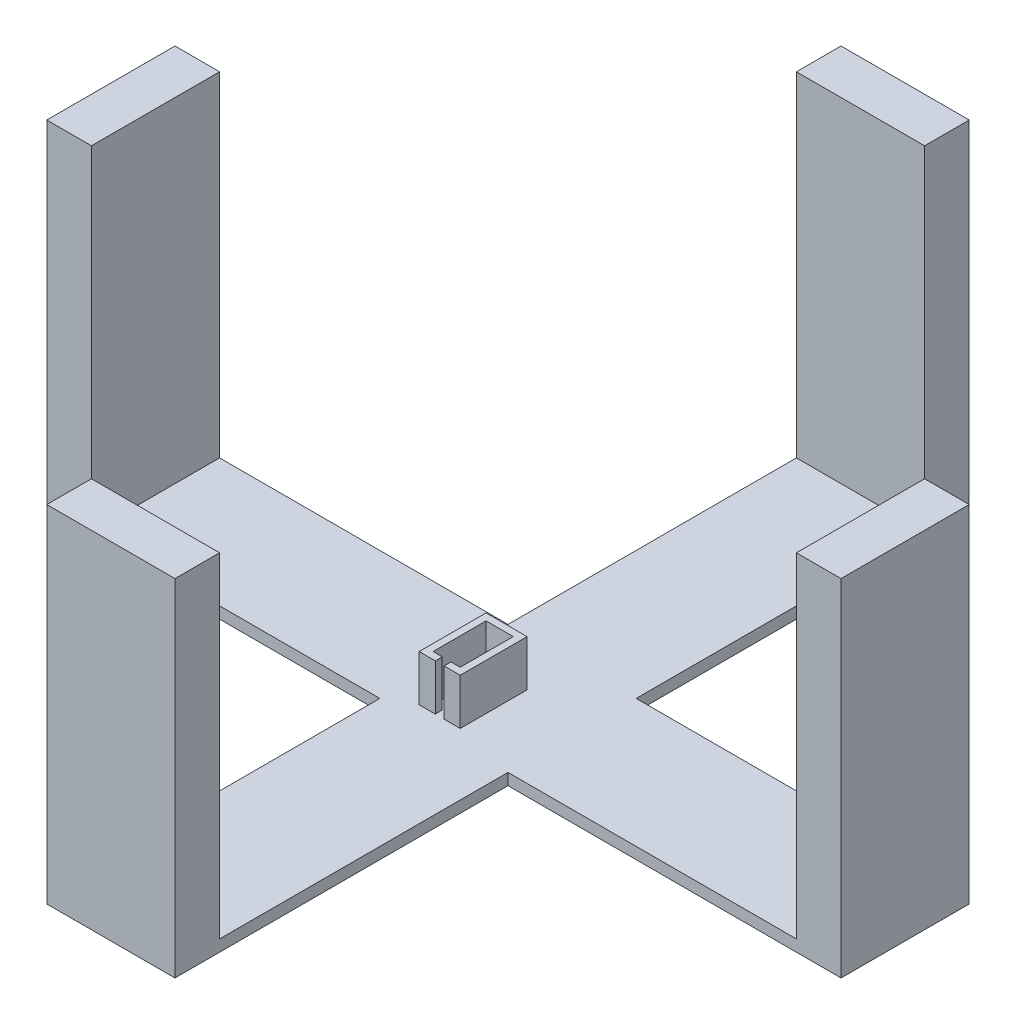
ISO-10303-21;
HEADER;
FILE_DESCRIPTION(('STEP AP214'),'2;1');
FILE_NAME('part.step','',(''),(''),'','','');
FILE_SCHEMA(('AUTOMOTIVE_DESIGN { 1 0 10303 214 1 1 1 1 }'));
ENDSEC;
DATA;
#1=APPLICATION_CONTEXT('core data for automotive mechanical design processes');
#2=APPLICATION_PROTOCOL_DEFINITION('international standard','automotive_design',2000,#1);
#3=PRODUCT_CONTEXT('',#1,'mechanical');
#4=PRODUCT('Part','Part','',(#3));
#5=PRODUCT_RELATED_PRODUCT_CATEGORY('part','',(#4));
#6=PRODUCT_DEFINITION_FORMATION('','',#4);
#7=PRODUCT_DEFINITION_CONTEXT('part definition',#1,'design');
#8=PRODUCT_DEFINITION('design','',#6,#7);
#9=PRODUCT_DEFINITION_SHAPE('','',#8);
#10=(LENGTH_UNIT() NAMED_UNIT(*) SI_UNIT(.MILLI.,.METRE.));
#11=(NAMED_UNIT(*) PLANE_ANGLE_UNIT() SI_UNIT($,.RADIAN.));
#12=(NAMED_UNIT(*) SI_UNIT($,.STERADIAN.) SOLID_ANGLE_UNIT());
#13=UNCERTAINTY_MEASURE_WITH_UNIT(LENGTH_MEASURE(1.E-05),#10,'distance_accuracy_value','');
#14=(GEOMETRIC_REPRESENTATION_CONTEXT(3) GLOBAL_UNCERTAINTY_ASSIGNED_CONTEXT((#13)) GLOBAL_UNIT_ASSIGNED_CONTEXT((#10,
#11,#12)) REPRESENTATION_CONTEXT('',''));
#15=CARTESIAN_POINT('',(0.,0.,0.));
#16=DIRECTION('',(0.,0.,1.));
#17=DIRECTION('',(1.,0.,0.));
#18=AXIS2_PLACEMENT_3D('',#15,#16,#17);
#19=CARTESIAN_POINT('',(0.,5.,0.));
#20=DIRECTION('',(0.,-1.,0.));
#21=DIRECTION('',(0.,0.,-1.));
#22=AXIS2_PLACEMENT_3D('',#19,#20,#21);
#23=PLANE('',#22);
#24=DIRECTION('',(0.,0.,1.));
#25=VECTOR('',#24,1.);
#26=CARTESIAN_POINT('',(-27.790839251623,5.,-27.7899999999997));
#27=LINE('',#26,#25);
#28=CARTESIAN_POINT('',(-27.7908392516244,5.,-152.848776632302));
#29=VERTEX_POINT('',#28);
#30=CARTESIAN_POINT('',(-27.790839251623,5.,-27.7908392516227));
#31=VERTEX_POINT('',#30);
#32=EDGE_CURVE('E475',#29,#31,#27,.T.);
#33=ORIENTED_EDGE('',*,*,#32,.T.);
#34=DIRECTION('',(-1.,0.,0.));
#35=VECTOR('',#34,1.);
#36=CARTESIAN_POINT('',(-27.79,5.,-27.7908392516227));
#37=LINE('',#36,#35);
#38=CARTESIAN_POINT('',(-152.848776632302,5.,-27.7908392516227));
#39=VERTEX_POINT('',#38);
#40=EDGE_CURVE('E532',#31,#39,#37,.T.);
#41=ORIENTED_EDGE('',*,*,#40,.T.);
#42=DIRECTION('',(0.,0.,1.));
#43=VECTOR('',#42,1.);
#44=CARTESIAN_POINT('',(-152.848776632302,5.,-27.7908392516227));
#45=LINE('',#44,#43);
#46=CARTESIAN_POINT('',(-152.848776632302,5.,27.7908392516228));
#47=VERTEX_POINT('',#46);
#48=EDGE_CURVE('E59',#39,#47,#45,.T.);
#49=ORIENTED_EDGE('',*,*,#48,.T.);
#50=DIRECTION('',(1.,0.,0.));
#51=VECTOR('',#50,1.);
#52=CARTESIAN_POINT('',(-27.79,5.,27.7908392516228));
#53=LINE('',#52,#51);
#54=CARTESIAN_POINT('',(-27.7908392516226,5.,27.7908392516228));
#55=VERTEX_POINT('',#54);
#56=EDGE_CURVE('E12',#47,#55,#53,.T.);
#57=ORIENTED_EDGE('',*,*,#56,.T.);
#58=DIRECTION('',(0.,0.,1.));
#59=VECTOR('',#58,1.);
#60=CARTESIAN_POINT('',(-27.7908392516226,5.,27.7900000000001));
#61=LINE('',#60,#59);
#62=CARTESIAN_POINT('',(-27.7908392516222,5.,152.848776632303));
#63=VERTEX_POINT('',#62);
#64=EDGE_CURVE('E508',#55,#63,#61,.T.);
#65=ORIENTED_EDGE('',*,*,#64,.T.);
#66=DIRECTION('',(1.,0.,0.));
#67=VECTOR('',#66,1.);
#68=CARTESIAN_POINT('',(-27.7908392516222,5.,152.848776632303));
#69=LINE('',#68,#67);
#70=CARTESIAN_POINT('',(27.7908392516233,5.,152.848776632302));
#71=VERTEX_POINT('',#70);
#72=EDGE_CURVE('E512',#63,#71,#69,.T.);
#73=ORIENTED_EDGE('',*,*,#72,.T.);
#74=DIRECTION('',(0.,0.,-1.));
#75=VECTOR('',#74,1.);
#76=CARTESIAN_POINT('',(27.7908392516229,5.,27.7899999999999));
#77=LINE('',#76,#75);
#78=CARTESIAN_POINT('',(27.7908392516229,5.,27.7908392516227));
#79=VERTEX_POINT('',#78);
#80=EDGE_CURVE('E519',#71,#79,#77,.T.);
#81=ORIENTED_EDGE('',*,*,#80,.T.);
#82=DIRECTION('',(1.,0.,0.));
#83=VECTOR('',#82,1.);
#84=CARTESIAN_POINT('',(27.79,5.,27.7908392516227));
#85=LINE('',#84,#83);
#86=CARTESIAN_POINT('',(152.848776632302,5.,27.7908392516227));
#87=VERTEX_POINT('',#86);
#88=EDGE_CURVE('E486',#79,#87,#85,.T.);
#89=ORIENTED_EDGE('',*,*,#88,.T.);
#90=DIRECTION('',(0.,0.,-1.));
#91=VECTOR('',#90,1.);
#92=CARTESIAN_POINT('',(152.848776632302,5.,27.7908392516227));
#93=LINE('',#92,#91);
#94=CARTESIAN_POINT('',(152.848776632302,5.,-27.7908392516228));
#95=VERTEX_POINT('',#94);
#96=EDGE_CURVE('E490',#87,#95,#93,.T.);
#97=ORIENTED_EDGE('',*,*,#96,.T.);
#98=DIRECTION('',(-1.,0.,0.));
#99=VECTOR('',#98,1.);
#100=CARTESIAN_POINT('',(27.79,5.,-27.7908392516228));
#101=LINE('',#100,#99);
#102=CARTESIAN_POINT('',(27.7908392516224,5.,-27.7908392516228));
#103=VERTEX_POINT('',#102);
#104=EDGE_CURVE('E497',#95,#103,#101,.T.);
#105=ORIENTED_EDGE('',*,*,#104,.T.);
#106=DIRECTION('',(0.,0.,-1.));
#107=VECTOR('',#106,1.);
#108=CARTESIAN_POINT('',(27.7908392516224,5.,-27.7900000000003));
#109=LINE('',#108,#107);
#110=CARTESIAN_POINT('',(27.7908392516211,5.,-152.848776632303));
#111=VERTEX_POINT('',#110);
#112=EDGE_CURVE('E463',#103,#111,#109,.T.);
#113=ORIENTED_EDGE('',*,*,#112,.T.);
#114=DIRECTION('',(-1.,0.,0.));
#115=VECTOR('',#114,1.);
#116=CARTESIAN_POINT('',(27.7908392516211,5.,-152.848776632303));
#117=LINE('',#116,#115);
#118=EDGE_CURVE('E467',#111,#29,#117,.T.);
#119=ORIENTED_EDGE('',*,*,#118,.T.);
#120=EDGE_LOOP('',(#33,#41,#49,#57,#65,#73,#81,#89,#97,#105,#113,#119));
#121=FACE_BOUND('',#120,.T.);
#122=DIRECTION('',(0.,0.,1.));
#123=VECTOR('',#122,1.);
#124=CARTESIAN_POINT('',(-16.8668625246052,5.,0.));
#125=LINE('',#124,#123);
#126=CARTESIAN_POINT('',(-16.8668625246052,5.,-7.34757532736929));
#127=VERTEX_POINT('',#126);
#128=CARTESIAN_POINT('',(-16.8668625246052,5.,21.6524246726307));
#129=VERTEX_POINT('',#128);
#130=EDGE_CURVE('E282',#127,#129,#125,.T.);
#131=ORIENTED_EDGE('',*,*,#130,.F.);
#132=DIRECTION('',(-1.,0.,0.));
#133=VECTOR('',#132,1.);
#134=CARTESIAN_POINT('',(0.,5.,-7.34757532736929));
#135=LINE('',#134,#133);
#136=CARTESIAN_POINT('',(0.933137475394828,5.,-7.34757532736929));
#137=VERTEX_POINT('',#136);
#138=EDGE_CURVE('E284',#137,#127,#135,.T.);
#139=ORIENTED_EDGE('',*,*,#138,.F.);
#140=DIRECTION('',(0.,0.,-1.));
#141=VECTOR('',#140,1.);
#142=CARTESIAN_POINT('',(0.933137475394829,5.,0.));
#143=LINE('',#142,#141);
#144=CARTESIAN_POINT('',(0.933137475394832,5.,21.6524246726307));
#145=VERTEX_POINT('',#144);
#146=EDGE_CURVE('E289',#145,#137,#143,.T.);
#147=ORIENTED_EDGE('',*,*,#146,.F.);
#148=DIRECTION('',(1.,0.,0.));
#149=VECTOR('',#148,1.);
#150=CARTESIAN_POINT('',(0.,5.,21.6524246726307));
#151=LINE('',#150,#149);
#152=CARTESIAN_POINT('',(-6.06686252460517,5.,21.6524246726307));
#153=VERTEX_POINT('',#152);
#154=EDGE_CURVE('E298',#153,#145,#151,.T.);
#155=ORIENTED_EDGE('',*,*,#154,.F.);
#156=DIRECTION('',(0.,0.,1.));
#157=VECTOR('',#156,1.);
#158=CARTESIAN_POINT('',(-6.06686252460517,5.,0.));
#159=LINE('',#158,#157);
#160=CARTESIAN_POINT('',(-6.06686252460517,5.,18.6524246726307));
#161=VERTEX_POINT('',#160);
#162=EDGE_CURVE('E302',#161,#153,#159,.T.);
#163=ORIENTED_EDGE('',*,*,#162,.F.);
#164=DIRECTION('',(-1.,0.,0.));
#165=VECTOR('',#164,1.);
#166=CARTESIAN_POINT('',(0.,5.,18.6524246726307));
#167=LINE('',#166,#165);
#168=CARTESIAN_POINT('',(-2.06686252460517,5.,18.6524246726307));
#169=VERTEX_POINT('',#168);
#170=EDGE_CURVE('E306',#169,#161,#167,.T.);
#171=ORIENTED_EDGE('',*,*,#170,.F.);
#172=DIRECTION('',(0.,0.,1.));
#173=VECTOR('',#172,1.);
#174=CARTESIAN_POINT('',(-2.06686252460517,5.,0.));
#175=LINE('',#174,#173);
#176=CARTESIAN_POINT('',(-2.06686252460517,5.,-4.34757532736929));
#177=VERTEX_POINT('',#176);
#178=EDGE_CURVE('E310',#177,#169,#175,.T.);
#179=ORIENTED_EDGE('',*,*,#178,.F.);
#180=DIRECTION('',(1.,0.,0.));
#181=VECTOR('',#180,1.);
#182=CARTESIAN_POINT('',(0.,5.,-4.34757532736929));
#183=LINE('',#182,#181);
#184=CARTESIAN_POINT('',(-13.8668625246052,5.,-4.34757532736929));
#185=VERTEX_POINT('',#184);
#186=EDGE_CURVE('E314',#185,#177,#183,.T.);
#187=ORIENTED_EDGE('',*,*,#186,.F.);
#188=DIRECTION('',(0.,0.,-1.));
#189=VECTOR('',#188,1.);
#190=CARTESIAN_POINT('',(-13.8668625246052,5.,0.));
#191=LINE('',#190,#189);
#192=CARTESIAN_POINT('',(-13.8668625246052,5.,18.6524246726307));
#193=VERTEX_POINT('',#192);
#194=EDGE_CURVE('E318',#193,#185,#191,.T.);
#195=ORIENTED_EDGE('',*,*,#194,.F.);
#196=DIRECTION('',(-1.,0.,0.));
#197=VECTOR('',#196,1.);
#198=CARTESIAN_POINT('',(0.,5.,18.6524246726307));
#199=LINE('',#198,#197);
#200=CARTESIAN_POINT('',(-9.86686252460518,5.,18.6524246726307));
#201=VERTEX_POINT('',#200);
#202=EDGE_CURVE('E322',#201,#193,#199,.T.);
#203=ORIENTED_EDGE('',*,*,#202,.F.);
#204=DIRECTION('',(0.,0.,-1.));
#205=VECTOR('',#204,1.);
#206=CARTESIAN_POINT('',(-9.86686252460518,5.,0.));
#207=LINE('',#206,#205);
#208=CARTESIAN_POINT('',(-9.86686252460518,5.,21.6524246726307));
#209=VERTEX_POINT('',#208);
#210=EDGE_CURVE('E72',#209,#201,#207,.T.);
#211=ORIENTED_EDGE('',*,*,#210,.F.);
#212=DIRECTION('',(1.,0.,0.));
#213=VECTOR('',#212,1.);
#214=CARTESIAN_POINT('',(0.,5.,21.6524246726307));
#215=LINE('',#214,#213);
#216=EDGE_CURVE('E67',#129,#209,#215,.T.);
#217=ORIENTED_EDGE('',*,*,#216,.F.);
#218=EDGE_LOOP('',(#131,#139,#147,#155,#163,#171,#179,#187,#195,#203,#211,#217));
#219=FACE_BOUND('',#218,.T.);
#220=ADVANCED_FACE('F49',(#121,#219),#23,.F.);
#221=CARTESIAN_POINT('',(-27.79,5.,-27.7908392516227));
#222=DIRECTION('',(0.,0.,1.));
#223=DIRECTION('',(1.,0.,0.));
#224=AXIS2_PLACEMENT_3D('',#221,#222,#223);
#225=PLANE('',#224);
#226=DIRECTION('',(0.,1.,0.));
#227=VECTOR('',#226,1.);
#228=CARTESIAN_POINT('',(-27.790839251623,5.,-27.7908392516227));
#229=LINE('',#228,#227);
#230=CARTESIAN_POINT('',(-27.790839251623,0.,-27.7908392516227));
#231=VERTEX_POINT('',#230);
#232=EDGE_CURVE('E523',#231,#31,#229,.T.);
#233=ORIENTED_EDGE('',*,*,#232,.F.);
#234=DIRECTION('',(-1.,0.,0.));
#235=VECTOR('',#234,1.);
#236=CARTESIAN_POINT('',(-27.79,0.,-27.7908392516227));
#237=LINE('',#236,#235);
#238=CARTESIAN_POINT('',(-172.199788795453,0.,-27.7908392516227));
#239=VERTEX_POINT('',#238);
#240=EDGE_CURVE('E531',#231,#239,#237,.T.);
#241=ORIENTED_EDGE('',*,*,#240,.T.);
#242=DIRECTION('',(0.,-1.,0.));
#243=VECTOR('',#242,1.);
#244=CARTESIAN_POINT('',(-172.199788795453,150.,-27.7908392516227));
#245=LINE('',#244,#243);
#246=CARTESIAN_POINT('',(-172.199788795453,150.,-27.7908392516227));
#247=VERTEX_POINT('',#246);
#248=EDGE_CURVE('E452',#247,#239,#245,.T.);
#249=ORIENTED_EDGE('',*,*,#248,.F.);
#250=DIRECTION('',(-1.,0.,0.));
#251=VECTOR('',#250,1.);
#252=CARTESIAN_POINT('',(-152.848776632302,150.,-27.7908392516227));
#253=LINE('',#252,#251);
#254=CARTESIAN_POINT('',(-152.848776632302,150.,-27.7908392516227));
#255=VERTEX_POINT('',#254);
#256=EDGE_CURVE('E433',#255,#247,#253,.T.);
#257=ORIENTED_EDGE('',*,*,#256,.F.);
#258=DIRECTION('',(0.,-1.,0.));
#259=VECTOR('',#258,1.);
#260=CARTESIAN_POINT('',(-152.848776632302,150.,-27.7908392516227));
#261=LINE('',#260,#259);
#262=EDGE_CURVE('E456',#255,#39,#261,.T.);
#263=ORIENTED_EDGE('',*,*,#262,.T.);
#264=ORIENTED_EDGE('',*,*,#40,.F.);
#265=EDGE_LOOP('',(#233,#241,#249,#257,#263,#264));
#266=FACE_BOUND('',#265,.T.);
#267=ADVANCED_FACE('F51',(#266),#225,.F.);
#268=CARTESIAN_POINT('',(-27.79,5.,27.7908392516228));
#269=DIRECTION('',(0.,0.,-1.));
#270=DIRECTION('',(-1.,0.,0.));
#271=AXIS2_PLACEMENT_3D('',#268,#269,#270);
#272=PLANE('',#271);
#273=DIRECTION('',(0.,-1.,0.));
#274=VECTOR('',#273,1.);
#275=CARTESIAN_POINT('',(-27.7908392516226,5.,27.7908392516228));
#276=LINE('',#275,#274);
#277=CARTESIAN_POINT('',(-27.7908392516226,0.,27.7908392516228));
#278=VERTEX_POINT('',#277);
#279=EDGE_CURVE('E527',#55,#278,#276,.T.);
#280=ORIENTED_EDGE('',*,*,#279,.F.);
#281=ORIENTED_EDGE('',*,*,#56,.F.);
#282=DIRECTION('',(0.,-1.,0.));
#283=VECTOR('',#282,1.);
#284=CARTESIAN_POINT('',(-152.848776632302,150.,27.7908392516228));
#285=LINE('',#284,#283);
#286=CARTESIAN_POINT('',(-152.848776632302,150.,27.7908392516228));
#287=VERTEX_POINT('',#286);
#288=EDGE_CURVE('E442',#287,#47,#285,.T.);
#289=ORIENTED_EDGE('',*,*,#288,.F.);
#290=DIRECTION('',(1.,0.,0.));
#291=VECTOR('',#290,1.);
#292=CARTESIAN_POINT('',(-152.848776632302,150.,27.7908392516228));
#293=LINE('',#292,#291);
#294=CARTESIAN_POINT('',(-172.199788795453,150.,27.7908392516228));
#295=VERTEX_POINT('',#294);
#296=EDGE_CURVE('E439',#295,#287,#293,.T.);
#297=ORIENTED_EDGE('',*,*,#296,.F.);
#298=DIRECTION('',(0.,-1.,0.));
#299=VECTOR('',#298,1.);
#300=CARTESIAN_POINT('',(-172.199788795453,150.,27.7908392516228));
#301=LINE('',#300,#299);
#302=CARTESIAN_POINT('',(-172.199788795453,0.,27.7908392516228));
#303=VERTEX_POINT('',#302);
#304=EDGE_CURVE('E448',#295,#303,#301,.T.);
#305=ORIENTED_EDGE('',*,*,#304,.T.);
#306=DIRECTION('',(1.,0.,0.));
#307=VECTOR('',#306,1.);
#308=CARTESIAN_POINT('',(-27.79,0.,27.7908392516228));
#309=LINE('',#308,#307);
#310=EDGE_CURVE('E53',#303,#278,#309,.T.);
#311=ORIENTED_EDGE('',*,*,#310,.T.);
#312=EDGE_LOOP('',(#280,#281,#289,#297,#305,#311));
#313=FACE_BOUND('',#312,.T.);
#314=ADVANCED_FACE('F544',(#313),#272,.F.);
#315=CARTESIAN_POINT('',(0.,0.,0.));
#316=DIRECTION('',(0.,-1.,0.));
#317=DIRECTION('',(0.,0.,-1.));
#318=AXIS2_PLACEMENT_3D('',#315,#316,#317);
#319=PLANE('',#318);
#320=ORIENTED_EDGE('',*,*,#240,.F.);
#321=DIRECTION('',(0.,0.,1.));
#322=VECTOR('',#321,1.);
#323=CARTESIAN_POINT('',(-27.790839251623,0.,-27.7899999999997));
#324=LINE('',#323,#322);
#325=CARTESIAN_POINT('',(-27.7908392516246,0.,-172.199788795453));
#326=VERTEX_POINT('',#325);
#327=EDGE_CURVE('E471',#326,#231,#324,.T.);
#328=ORIENTED_EDGE('',*,*,#327,.F.);
#329=DIRECTION('',(-1.,0.,0.));
#330=VECTOR('',#329,1.);
#331=CARTESIAN_POINT('',(27.7908392516209,0.,-172.199788795454));
#332=LINE('',#331,#330);
#333=CARTESIAN_POINT('',(27.7908392516209,0.,-172.199788795454));
#334=VERTEX_POINT('',#333);
#335=EDGE_CURVE('E332',#334,#326,#332,.T.);
#336=ORIENTED_EDGE('',*,*,#335,.F.);
#337=DIRECTION('',(0.,0.,-1.));
#338=VECTOR('',#337,1.);
#339=CARTESIAN_POINT('',(27.7908392516224,0.,-27.7900000000003));
#340=LINE('',#339,#338);
#341=CARTESIAN_POINT('',(27.7908392516224,0.,-27.7908392516228));
#342=VERTEX_POINT('',#341);
#343=EDGE_CURVE('E460',#342,#334,#340,.T.);
#344=ORIENTED_EDGE('',*,*,#343,.F.);
#345=DIRECTION('',(-1.,0.,0.));
#346=VECTOR('',#345,1.);
#347=CARTESIAN_POINT('',(27.79,0.,-27.7908392516228));
#348=LINE('',#347,#346);
#349=CARTESIAN_POINT('',(172.199788795453,0.,-27.7908392516228));
#350=VERTEX_POINT('',#349);
#351=EDGE_CURVE('E494',#350,#342,#348,.T.);
#352=ORIENTED_EDGE('',*,*,#351,.F.);
#353=DIRECTION('',(0.,0.,-1.));
#354=VECTOR('',#353,1.);
#355=CARTESIAN_POINT('',(172.199788795453,0.,27.7908392516227));
#356=LINE('',#355,#354);
#357=CARTESIAN_POINT('',(172.199788795453,0.,27.7908392516227));
#358=VERTEX_POINT('',#357);
#359=EDGE_CURVE('E364',#358,#350,#356,.T.);
#360=ORIENTED_EDGE('',*,*,#359,.F.);
#361=DIRECTION('',(1.,0.,0.));
#362=VECTOR('',#361,1.);
#363=CARTESIAN_POINT('',(27.79,0.,27.7908392516227));
#364=LINE('',#363,#362);
#365=CARTESIAN_POINT('',(27.7908392516229,0.,27.7908392516227));
#366=VERTEX_POINT('',#365);
#367=EDGE_CURVE('E483',#366,#358,#364,.T.);
#368=ORIENTED_EDGE('',*,*,#367,.F.);
#369=DIRECTION('',(0.,0.,-1.));
#370=VECTOR('',#369,1.);
#371=CARTESIAN_POINT('',(27.7908392516229,0.,27.7899999999999));
#372=LINE('',#371,#370);
#373=CARTESIAN_POINT('',(27.7908392516234,0.,172.199788795453));
#374=VERTEX_POINT('',#373);
#375=EDGE_CURVE('E516',#374,#366,#372,.T.);
#376=ORIENTED_EDGE('',*,*,#375,.F.);
#377=DIRECTION('',(1.,0.,0.));
#378=VECTOR('',#377,1.);
#379=CARTESIAN_POINT('',(-27.7908392516221,0.,172.199788795454));
#380=LINE('',#379,#378);
#381=CARTESIAN_POINT('',(-27.7908392516221,0.,172.199788795454));
#382=VERTEX_POINT('',#381);
#383=EDGE_CURVE('E396',#382,#374,#380,.T.);
#384=ORIENTED_EDGE('',*,*,#383,.F.);
#385=DIRECTION('',(0.,0.,1.));
#386=VECTOR('',#385,1.);
#387=CARTESIAN_POINT('',(-27.7908392516226,0.,27.7900000000001));
#388=LINE('',#387,#386);
#389=EDGE_CURVE('E505',#278,#382,#388,.T.);
#390=ORIENTED_EDGE('',*,*,#389,.F.);
#391=ORIENTED_EDGE('',*,*,#310,.F.);
#392=DIRECTION('',(0.,0.,1.));
#393=VECTOR('',#392,1.);
#394=CARTESIAN_POINT('',(-172.199788795453,0.,-27.7908392516227));
#395=LINE('',#394,#393);
#396=EDGE_CURVE('E428',#239,#303,#395,.T.);
#397=ORIENTED_EDGE('',*,*,#396,.F.);
#398=EDGE_LOOP('',(#320,#328,#336,#344,#352,#360,#368,#376,#384,#390,#391,#397));
#399=FACE_BOUND('',#398,.T.);
#400=ADVANCED_FACE('F556',(#399),#319,.T.);
#401=CARTESIAN_POINT('',(-27.7908392516226,5.,27.7900000000001));
#402=DIRECTION('',(1.,0.,0.));
#403=DIRECTION('',(0.,0.,-1.));
#404=AXIS2_PLACEMENT_3D('',#401,#402,#403);
#405=PLANE('',#404);
#406=ORIENTED_EDGE('',*,*,#64,.F.);
#407=ORIENTED_EDGE('',*,*,#279,.T.);
#408=ORIENTED_EDGE('',*,*,#389,.T.);
#409=DIRECTION('',(0.,-1.,0.));
#410=VECTOR('',#409,1.);
#411=CARTESIAN_POINT('',(-27.7908392516221,150.,172.199788795454));
#412=LINE('',#411,#410);
#413=CARTESIAN_POINT('',(-27.7908392516221,150.,172.199788795454));
#414=VERTEX_POINT('',#413);
#415=EDGE_CURVE('E420',#414,#382,#412,.T.);
#416=ORIENTED_EDGE('',*,*,#415,.F.);
#417=DIRECTION('',(0.,0.,1.));
#418=VECTOR('',#417,1.);
#419=CARTESIAN_POINT('',(-27.7908392516222,150.,152.848776632303));
#420=LINE('',#419,#418);
#421=CARTESIAN_POINT('',(-27.7908392516222,150.,152.848776632303));
#422=VERTEX_POINT('',#421);
#423=EDGE_CURVE('E401',#422,#414,#420,.T.);
#424=ORIENTED_EDGE('',*,*,#423,.F.);
#425=DIRECTION('',(0.,-1.,0.));
#426=VECTOR('',#425,1.);
#427=CARTESIAN_POINT('',(-27.7908392516222,150.,152.848776632303));
#428=LINE('',#427,#426);
#429=EDGE_CURVE('E424',#422,#63,#428,.T.);
#430=ORIENTED_EDGE('',*,*,#429,.T.);
#431=EDGE_LOOP('',(#406,#407,#408,#416,#424,#430));
#432=FACE_BOUND('',#431,.T.);
#433=ADVANCED_FACE('F553',(#432),#405,.F.);
#434=CARTESIAN_POINT('',(-27.790839251623,5.,-27.7899999999997));
#435=DIRECTION('',(1.,0.,0.));
#436=DIRECTION('',(0.,0.,-1.));
#437=AXIS2_PLACEMENT_3D('',#434,#435,#436);
#438=PLANE('',#437);
#439=ORIENTED_EDGE('',*,*,#327,.T.);
#440=ORIENTED_EDGE('',*,*,#232,.T.);
#441=ORIENTED_EDGE('',*,*,#32,.F.);
#442=DIRECTION('',(0.,-1.,0.));
#443=VECTOR('',#442,1.);
#444=CARTESIAN_POINT('',(-27.7908392516244,150.,-152.848776632302));
#445=LINE('',#444,#443);
#446=CARTESIAN_POINT('',(-27.7908392516244,150.,-152.848776632302));
#447=VERTEX_POINT('',#446);
#448=EDGE_CURVE('E346',#447,#29,#445,.T.);
#449=ORIENTED_EDGE('',*,*,#448,.F.);
#450=DIRECTION('',(0.,0.,1.));
#451=VECTOR('',#450,1.);
#452=CARTESIAN_POINT('',(-27.7908392516244,150.,-152.848776632302));
#453=LINE('',#452,#451);
#454=CARTESIAN_POINT('',(-27.7908392516246,150.,-172.199788795453));
#455=VERTEX_POINT('',#454);
#456=EDGE_CURVE('E343',#455,#447,#453,.T.);
#457=ORIENTED_EDGE('',*,*,#456,.F.);
#458=DIRECTION('',(0.,-1.,0.));
#459=VECTOR('',#458,1.);
#460=CARTESIAN_POINT('',(-27.7908392516246,150.,-172.199788795453));
#461=LINE('',#460,#459);
#462=EDGE_CURVE('E352',#455,#326,#461,.T.);
#463=ORIENTED_EDGE('',*,*,#462,.T.);
#464=EDGE_LOOP('',(#439,#440,#441,#449,#457,#463));
#465=FACE_BOUND('',#464,.T.);
#466=ADVANCED_FACE('F585',(#465),#438,.F.);
#467=CARTESIAN_POINT('',(27.7908392516229,5.,27.7899999999999));
#468=DIRECTION('',(-1.,0.,0.));
#469=DIRECTION('',(0.,0.,1.));
#470=AXIS2_PLACEMENT_3D('',#467,#468,#469);
#471=PLANE('',#470);
#472=DIRECTION('',(0.,-1.,0.));
#473=VECTOR('',#472,1.);
#474=CARTESIAN_POINT('',(27.7908392516229,5.,27.7908392516227));
#475=LINE('',#474,#473);
#476=EDGE_CURVE('E501',#79,#366,#475,.T.);
#477=ORIENTED_EDGE('',*,*,#476,.F.);
#478=ORIENTED_EDGE('',*,*,#80,.F.);
#479=DIRECTION('',(0.,-1.,0.));
#480=VECTOR('',#479,1.);
#481=CARTESIAN_POINT('',(27.7908392516233,150.,152.848776632302));
#482=LINE('',#481,#480);
#483=CARTESIAN_POINT('',(27.7908392516233,150.,152.848776632302));
#484=VERTEX_POINT('',#483);
#485=EDGE_CURVE('E410',#484,#71,#482,.T.);
#486=ORIENTED_EDGE('',*,*,#485,.F.);
#487=DIRECTION('',(0.,0.,-1.));
#488=VECTOR('',#487,1.);
#489=CARTESIAN_POINT('',(27.7908392516233,150.,152.848776632302));
#490=LINE('',#489,#488);
#491=CARTESIAN_POINT('',(27.7908392516234,150.,172.199788795453));
#492=VERTEX_POINT('',#491);
#493=EDGE_CURVE('E407',#492,#484,#490,.T.);
#494=ORIENTED_EDGE('',*,*,#493,.F.);
#495=DIRECTION('',(0.,-1.,0.));
#496=VECTOR('',#495,1.);
#497=CARTESIAN_POINT('',(27.7908392516234,150.,172.199788795453));
#498=LINE('',#497,#496);
#499=EDGE_CURVE('E416',#492,#374,#498,.T.);
#500=ORIENTED_EDGE('',*,*,#499,.T.);
#501=ORIENTED_EDGE('',*,*,#375,.T.);
#502=EDGE_LOOP('',(#477,#478,#486,#494,#500,#501));
#503=FACE_BOUND('',#502,.T.);
#504=ADVANCED_FACE('F564',(#503),#471,.F.);
#505=CARTESIAN_POINT('',(27.79,5.,27.7908392516227));
#506=DIRECTION('',(0.,0.,-1.));
#507=DIRECTION('',(-1.,0.,0.));
#508=AXIS2_PLACEMENT_3D('',#505,#506,#507);
#509=PLANE('',#508);
#510=ORIENTED_EDGE('',*,*,#88,.F.);
#511=ORIENTED_EDGE('',*,*,#476,.T.);
#512=ORIENTED_EDGE('',*,*,#367,.T.);
#513=DIRECTION('',(0.,-1.,0.));
#514=VECTOR('',#513,1.);
#515=CARTESIAN_POINT('',(172.199788795453,150.,27.7908392516227));
#516=LINE('',#515,#514);
#517=CARTESIAN_POINT('',(172.199788795453,150.,27.7908392516227));
#518=VERTEX_POINT('',#517);
#519=EDGE_CURVE('E388',#518,#358,#516,.T.);
#520=ORIENTED_EDGE('',*,*,#519,.F.);
#521=DIRECTION('',(1.,0.,0.));
#522=VECTOR('',#521,1.);
#523=CARTESIAN_POINT('',(152.848776632302,150.,27.7908392516227));
#524=LINE('',#523,#522);
#525=CARTESIAN_POINT('',(152.848776632302,150.,27.7908392516227));
#526=VERTEX_POINT('',#525);
#527=EDGE_CURVE('E369',#526,#518,#524,.T.);
#528=ORIENTED_EDGE('',*,*,#527,.F.);
#529=DIRECTION('',(0.,-1.,0.));
#530=VECTOR('',#529,1.);
#531=CARTESIAN_POINT('',(152.848776632302,150.,27.7908392516227));
#532=LINE('',#531,#530);
#533=EDGE_CURVE('E392',#526,#87,#532,.T.);
#534=ORIENTED_EDGE('',*,*,#533,.T.);
#535=EDGE_LOOP('',(#510,#511,#512,#520,#528,#534));
#536=FACE_BOUND('',#535,.T.);
#537=ADVANCED_FACE('F609',(#536),#509,.F.);
#538=CARTESIAN_POINT('',(27.79,5.,-27.7908392516228));
#539=DIRECTION('',(0.,0.,1.));
#540=DIRECTION('',(1.,0.,0.));
#541=AXIS2_PLACEMENT_3D('',#538,#539,#540);
#542=PLANE('',#541);
#543=DIRECTION('',(0.,-1.,0.));
#544=VECTOR('',#543,1.);
#545=CARTESIAN_POINT('',(27.7908392516224,5.,-27.7908392516228));
#546=LINE('',#545,#544);
#547=EDGE_CURVE('E479',#103,#342,#546,.T.);
#548=ORIENTED_EDGE('',*,*,#547,.F.);
#549=ORIENTED_EDGE('',*,*,#104,.F.);
#550=DIRECTION('',(0.,-1.,0.));
#551=VECTOR('',#550,1.);
#552=CARTESIAN_POINT('',(152.848776632302,150.,-27.7908392516228));
#553=LINE('',#552,#551);
#554=CARTESIAN_POINT('',(152.848776632302,150.,-27.7908392516228));
#555=VERTEX_POINT('',#554);
#556=EDGE_CURVE('E378',#555,#95,#553,.T.);
#557=ORIENTED_EDGE('',*,*,#556,.F.);
#558=DIRECTION('',(-1.,0.,0.));
#559=VECTOR('',#558,1.);
#560=CARTESIAN_POINT('',(152.848776632302,150.,-27.7908392516228));
#561=LINE('',#560,#559);
#562=CARTESIAN_POINT('',(172.199788795453,150.,-27.7908392516228));
#563=VERTEX_POINT('',#562);
#564=EDGE_CURVE('E375',#563,#555,#561,.T.);
#565=ORIENTED_EDGE('',*,*,#564,.F.);
#566=DIRECTION('',(0.,-1.,0.));
#567=VECTOR('',#566,1.);
#568=CARTESIAN_POINT('',(172.199788795453,150.,-27.7908392516228));
#569=LINE('',#568,#567);
#570=EDGE_CURVE('E384',#563,#350,#569,.T.);
#571=ORIENTED_EDGE('',*,*,#570,.T.);
#572=ORIENTED_EDGE('',*,*,#351,.T.);
#573=EDGE_LOOP('',(#548,#549,#557,#565,#571,#572));
#574=FACE_BOUND('',#573,.T.);
#575=ADVANCED_FACE('F601',(#574),#542,.F.);
#576=CARTESIAN_POINT('',(27.7908392516224,5.,-27.7900000000003));
#577=DIRECTION('',(-1.,0.,0.));
#578=DIRECTION('',(0.,0.,1.));
#579=AXIS2_PLACEMENT_3D('',#576,#577,#578);
#580=PLANE('',#579);
#581=ORIENTED_EDGE('',*,*,#112,.F.);
#582=ORIENTED_EDGE('',*,*,#547,.T.);
#583=ORIENTED_EDGE('',*,*,#343,.T.);
#584=DIRECTION('',(0.,-1.,0.));
#585=VECTOR('',#584,1.);
#586=CARTESIAN_POINT('',(27.7908392516209,150.,-172.199788795454));
#587=LINE('',#586,#585);
#588=CARTESIAN_POINT('',(27.7908392516209,150.,-172.199788795454));
#589=VERTEX_POINT('',#588);
#590=EDGE_CURVE('E356',#589,#334,#587,.T.);
#591=ORIENTED_EDGE('',*,*,#590,.F.);
#592=DIRECTION('',(0.,0.,-1.));
#593=VECTOR('',#592,1.);
#594=CARTESIAN_POINT('',(27.7908392516211,150.,-152.848776632303));
#595=LINE('',#594,#593);
#596=CARTESIAN_POINT('',(27.7908392516211,150.,-152.848776632303));
#597=VERTEX_POINT('',#596);
#598=EDGE_CURVE('E337',#597,#589,#595,.T.);
#599=ORIENTED_EDGE('',*,*,#598,.F.);
#600=DIRECTION('',(0.,-1.,0.));
#601=VECTOR('',#600,1.);
#602=CARTESIAN_POINT('',(27.7908392516211,150.,-152.848776632303));
#603=LINE('',#602,#601);
#604=EDGE_CURVE('E360',#597,#111,#603,.T.);
#605=ORIENTED_EDGE('',*,*,#604,.T.);
#606=EDGE_LOOP('',(#581,#582,#583,#591,#599,#605));
#607=FACE_BOUND('',#606,.T.);
#608=ADVANCED_FACE('F598',(#607),#580,.F.);
#609=CARTESIAN_POINT('',(-152.848776632302,150.,-27.7908392516227));
#610=DIRECTION('',(-1.,0.,0.));
#611=DIRECTION('',(0.,0.,1.));
#612=AXIS2_PLACEMENT_3D('',#609,#610,#611);
#613=PLANE('',#612);
#614=ORIENTED_EDGE('',*,*,#48,.F.);
#615=ORIENTED_EDGE('',*,*,#262,.F.);
#616=DIRECTION('',(0.,0.,-1.));
#617=VECTOR('',#616,1.);
#618=CARTESIAN_POINT('',(-152.848776632302,150.,-27.7908392516227));
#619=LINE('',#618,#617);
#620=EDGE_CURVE('E429',#287,#255,#619,.T.);
#621=ORIENTED_EDGE('',*,*,#620,.F.);
#622=ORIENTED_EDGE('',*,*,#288,.T.);
#623=EDGE_LOOP('',(#614,#615,#621,#622));
#624=FACE_BOUND('',#623,.T.);
#625=ADVANCED_FACE('F577',(#624),#613,.F.);
#626=CARTESIAN_POINT('',(-172.199788795453,150.,-27.7908392516227));
#627=DIRECTION('',(1.,0.,0.));
#628=DIRECTION('',(0.,0.,-1.));
#629=AXIS2_PLACEMENT_3D('',#626,#627,#628);
#630=PLANE('',#629);
#631=ORIENTED_EDGE('',*,*,#396,.T.);
#632=ORIENTED_EDGE('',*,*,#304,.F.);
#633=DIRECTION('',(0.,0.,1.));
#634=VECTOR('',#633,1.);
#635=CARTESIAN_POINT('',(-172.199788795453,150.,-27.7908392516227));
#636=LINE('',#635,#634);
#637=EDGE_CURVE('E436',#247,#295,#636,.T.);
#638=ORIENTED_EDGE('',*,*,#637,.F.);
#639=ORIENTED_EDGE('',*,*,#248,.T.);
#640=EDGE_LOOP('',(#631,#632,#638,#639));
#641=FACE_BOUND('',#640,.T.);
#642=ADVANCED_FACE('F582',(#641),#630,.F.);
#643=CARTESIAN_POINT('',(0.,150.,0.));
#644=DIRECTION('',(0.,-1.,0.));
#645=DIRECTION('',(0.,0.,-1.));
#646=AXIS2_PLACEMENT_3D('',#643,#644,#645);
#647=PLANE('',#646);
#648=ORIENTED_EDGE('',*,*,#620,.T.);
#649=ORIENTED_EDGE('',*,*,#256,.T.);
#650=ORIENTED_EDGE('',*,*,#637,.T.);
#651=ORIENTED_EDGE('',*,*,#296,.T.);
#652=EDGE_LOOP('',(#648,#649,#650,#651));
#653=FACE_BOUND('',#652,.T.);
#654=ADVANCED_FACE('F579',(#653),#647,.F.);
#655=CARTESIAN_POINT('',(-27.7908392516222,150.,152.848776632303));
#656=DIRECTION('',(0.,0.,1.));
#657=DIRECTION('',(1.,0.,0.));
#658=AXIS2_PLACEMENT_3D('',#655,#656,#657);
#659=PLANE('',#658);
#660=ORIENTED_EDGE('',*,*,#72,.F.);
#661=ORIENTED_EDGE('',*,*,#429,.F.);
#662=DIRECTION('',(-1.,0.,0.));
#663=VECTOR('',#662,1.);
#664=CARTESIAN_POINT('',(-27.7908392516222,150.,152.848776632303));
#665=LINE('',#664,#663);
#666=EDGE_CURVE('E397',#484,#422,#665,.T.);
#667=ORIENTED_EDGE('',*,*,#666,.F.);
#668=ORIENTED_EDGE('',*,*,#485,.T.);
#669=EDGE_LOOP('',(#660,#661,#667,#668));
#670=FACE_BOUND('',#669,.T.);
#671=ADVANCED_FACE('F699',(#670),#659,.F.);
#672=CARTESIAN_POINT('',(-27.7908392516221,150.,172.199788795454));
#673=DIRECTION('',(0.,0.,-1.));
#674=DIRECTION('',(-1.,0.,0.));
#675=AXIS2_PLACEMENT_3D('',#672,#673,#674);
#676=PLANE('',#675);
#677=ORIENTED_EDGE('',*,*,#383,.T.);
#678=ORIENTED_EDGE('',*,*,#499,.F.);
#679=DIRECTION('',(1.,0.,0.));
#680=VECTOR('',#679,1.);
#681=CARTESIAN_POINT('',(-27.7908392516221,150.,172.199788795454));
#682=LINE('',#681,#680);
#683=EDGE_CURVE('E404',#414,#492,#682,.T.);
#684=ORIENTED_EDGE('',*,*,#683,.F.);
#685=ORIENTED_EDGE('',*,*,#415,.T.);
#686=EDGE_LOOP('',(#677,#678,#684,#685));
#687=FACE_BOUND('',#686,.T.);
#688=ADVANCED_FACE('F560',(#687),#676,.F.);
#689=CARTESIAN_POINT('',(0.,150.,0.));
#690=DIRECTION('',(0.,-1.,0.));
#691=DIRECTION('',(-1.,0.,0.));
#692=AXIS2_PLACEMENT_3D('',#689,#690,#691);
#693=PLANE('',#692);
#694=ORIENTED_EDGE('',*,*,#666,.T.);
#695=ORIENTED_EDGE('',*,*,#423,.T.);
#696=ORIENTED_EDGE('',*,*,#683,.T.);
#697=ORIENTED_EDGE('',*,*,#493,.T.);
#698=EDGE_LOOP('',(#694,#695,#696,#697));
#699=FACE_BOUND('',#698,.T.);
#700=ADVANCED_FACE('F569',(#699),#693,.F.);
#701=CARTESIAN_POINT('',(152.848776632302,150.,27.7908392516227));
#702=DIRECTION('',(1.,0.,0.));
#703=DIRECTION('',(0.,0.,-1.));
#704=AXIS2_PLACEMENT_3D('',#701,#702,#703);
#705=PLANE('',#704);
#706=ORIENTED_EDGE('',*,*,#96,.F.);
#707=ORIENTED_EDGE('',*,*,#533,.F.);
#708=DIRECTION('',(0.,0.,1.));
#709=VECTOR('',#708,1.);
#710=CARTESIAN_POINT('',(152.848776632302,150.,27.7908392516227));
#711=LINE('',#710,#709);
#712=EDGE_CURVE('E365',#555,#526,#711,.T.);
#713=ORIENTED_EDGE('',*,*,#712,.F.);
#714=ORIENTED_EDGE('',*,*,#556,.T.);
#715=EDGE_LOOP('',(#706,#707,#713,#714));
#716=FACE_BOUND('',#715,.T.);
#717=ADVANCED_FACE('F606',(#716),#705,.F.);
#718=CARTESIAN_POINT('',(172.199788795453,150.,27.7908392516227));
#719=DIRECTION('',(-1.,0.,0.));
#720=DIRECTION('',(0.,0.,1.));
#721=AXIS2_PLACEMENT_3D('',#718,#719,#720);
#722=PLANE('',#721);
#723=ORIENTED_EDGE('',*,*,#359,.T.);
#724=ORIENTED_EDGE('',*,*,#570,.F.);
#725=DIRECTION('',(0.,0.,-1.));
#726=VECTOR('',#725,1.);
#727=CARTESIAN_POINT('',(172.199788795453,150.,27.7908392516227));
#728=LINE('',#727,#726);
#729=EDGE_CURVE('E372',#518,#563,#728,.T.);
#730=ORIENTED_EDGE('',*,*,#729,.F.);
#731=ORIENTED_EDGE('',*,*,#519,.T.);
#732=EDGE_LOOP('',(#723,#724,#730,#731));
#733=FACE_BOUND('',#732,.T.);
#734=ADVANCED_FACE('F617',(#733),#722,.F.);
#735=CARTESIAN_POINT('',(0.,150.,0.));
#736=DIRECTION('',(0.,-1.,0.));
#737=DIRECTION('',(0.,0.,1.));
#738=AXIS2_PLACEMENT_3D('',#735,#736,#737);
#739=PLANE('',#738);
#740=ORIENTED_EDGE('',*,*,#712,.T.);
#741=ORIENTED_EDGE('',*,*,#527,.T.);
#742=ORIENTED_EDGE('',*,*,#729,.T.);
#743=ORIENTED_EDGE('',*,*,#564,.T.);
#744=EDGE_LOOP('',(#740,#741,#742,#743));
#745=FACE_BOUND('',#744,.T.);
#746=ADVANCED_FACE('F613',(#745),#739,.F.);
#747=CARTESIAN_POINT('',(27.7908392516211,150.,-152.848776632303));
#748=DIRECTION('',(0.,0.,-1.));
#749=DIRECTION('',(-1.,0.,0.));
#750=AXIS2_PLACEMENT_3D('',#747,#748,#749);
#751=PLANE('',#750);
#752=ORIENTED_EDGE('',*,*,#118,.F.);
#753=ORIENTED_EDGE('',*,*,#604,.F.);
#754=DIRECTION('',(1.,0.,0.));
#755=VECTOR('',#754,1.);
#756=CARTESIAN_POINT('',(27.7908392516211,150.,-152.848776632303));
#757=LINE('',#756,#755);
#758=EDGE_CURVE('E333',#447,#597,#757,.T.);
#759=ORIENTED_EDGE('',*,*,#758,.F.);
#760=ORIENTED_EDGE('',*,*,#448,.T.);
#761=EDGE_LOOP('',(#752,#753,#759,#760));
#762=FACE_BOUND('',#761,.T.);
#763=ADVANCED_FACE('F624',(#762),#751,.F.);
#764=CARTESIAN_POINT('',(27.7908392516209,150.,-172.199788795454));
#765=DIRECTION('',(0.,0.,1.));
#766=DIRECTION('',(1.,0.,0.));
#767=AXIS2_PLACEMENT_3D('',#764,#765,#766);
#768=PLANE('',#767);
#769=ORIENTED_EDGE('',*,*,#335,.T.);
#770=ORIENTED_EDGE('',*,*,#462,.F.);
#771=DIRECTION('',(-1.,0.,0.));
#772=VECTOR('',#771,1.);
#773=CARTESIAN_POINT('',(27.7908392516209,150.,-172.199788795454));
#774=LINE('',#773,#772);
#775=EDGE_CURVE('E340',#589,#455,#774,.T.);
#776=ORIENTED_EDGE('',*,*,#775,.F.);
#777=ORIENTED_EDGE('',*,*,#590,.T.);
#778=EDGE_LOOP('',(#769,#770,#776,#777));
#779=FACE_BOUND('',#778,.T.);
#780=ADVANCED_FACE('F592',(#779),#768,.F.);
#781=CARTESIAN_POINT('',(0.,150.,0.));
#782=DIRECTION('',(0.,-1.,0.));
#783=DIRECTION('',(1.,0.,0.));
#784=AXIS2_PLACEMENT_3D('',#781,#782,#783);
#785=PLANE('',#784);
#786=ORIENTED_EDGE('',*,*,#758,.T.);
#787=ORIENTED_EDGE('',*,*,#598,.T.);
#788=ORIENTED_EDGE('',*,*,#775,.T.);
#789=ORIENTED_EDGE('',*,*,#456,.T.);
#790=EDGE_LOOP('',(#786,#787,#788,#789));
#791=FACE_BOUND('',#790,.T.);
#792=ADVANCED_FACE('F749',(#791),#785,.F.);
#793=CARTESIAN_POINT('',(-16.8668625246052,25.,21.6524246726307));
#794=DIRECTION('',(1.,0.,0.));
#795=DIRECTION('',(0.,0.,-1.));
#796=AXIS2_PLACEMENT_3D('',#793,#794,#795);
#797=PLANE('',#796);
#798=DIRECTION('',(0.,-1.,0.));
#799=VECTOR('',#798,1.);
#800=CARTESIAN_POINT('',(-16.8668625246052,25.,-7.34757532736929));
#801=LINE('',#800,#799);
#802=CARTESIAN_POINT('',(-16.8668625246052,25.,-7.34757532736929));
#803=VERTEX_POINT('',#802);
#804=EDGE_CURVE('E898',#803,#127,#801,.T.);
#805=ORIENTED_EDGE('',*,*,#804,.T.);
#806=ORIENTED_EDGE('',*,*,#130,.T.);
#807=DIRECTION('',(0.,-1.,0.));
#808=VECTOR('',#807,1.);
#809=CARTESIAN_POINT('',(-16.8668625246052,25.,21.6524246726307));
#810=LINE('',#809,#808);
#811=CARTESIAN_POINT('',(-16.8668625246052,25.,21.6524246726307));
#812=VERTEX_POINT('',#811);
#813=EDGE_CURVE('E263',#812,#129,#810,.T.);
#814=ORIENTED_EDGE('',*,*,#813,.F.);
#815=DIRECTION('',(0.,0.,1.));
#816=VECTOR('',#815,1.);
#817=CARTESIAN_POINT('',(-16.8668625246052,25.,21.6524246726307));
#818=LINE('',#817,#816);
#819=EDGE_CURVE('E270',#803,#812,#818,.T.);
#820=ORIENTED_EDGE('',*,*,#819,.F.);
#821=EDGE_LOOP('',(#805,#806,#814,#820));
#822=FACE_BOUND('',#821,.T.);
#823=ADVANCED_FACE('F281',(#822),#797,.F.);
#824=CARTESIAN_POINT('',(-9.86686252460518,25.,21.6524246726307));
#825=DIRECTION('',(0.,0.,-1.));
#826=DIRECTION('',(-1.,0.,0.));
#827=AXIS2_PLACEMENT_3D('',#824,#825,#826);
#828=PLANE('',#827);
#829=ORIENTED_EDGE('',*,*,#813,.T.);
#830=ORIENTED_EDGE('',*,*,#216,.T.);
#831=DIRECTION('',(0.,-1.,0.));
#832=VECTOR('',#831,1.);
#833=CARTESIAN_POINT('',(-9.86686252460518,25.,21.6524246726307));
#834=LINE('',#833,#832);
#835=CARTESIAN_POINT('',(-9.86686252460518,25.,21.6524246726307));
#836=VERTEX_POINT('',#835);
#837=EDGE_CURVE('E265',#836,#209,#834,.T.);
#838=ORIENTED_EDGE('',*,*,#837,.F.);
#839=DIRECTION('',(1.,0.,0.));
#840=VECTOR('',#839,1.);
#841=CARTESIAN_POINT('',(-9.86686252460518,25.,21.6524246726307));
#842=LINE('',#841,#840);
#843=EDGE_CURVE('E259',#812,#836,#842,.T.);
#844=ORIENTED_EDGE('',*,*,#843,.F.);
#845=EDGE_LOOP('',(#829,#830,#838,#844));
#846=FACE_BOUND('',#845,.T.);
#847=ADVANCED_FACE('F261',(#846),#828,.F.);
#848=CARTESIAN_POINT('',(-9.86686252460518,25.,18.6524246726307));
#849=DIRECTION('',(-1.,0.,0.));
#850=DIRECTION('',(0.,0.,1.));
#851=AXIS2_PLACEMENT_3D('',#848,#849,#850);
#852=PLANE('',#851);
#853=ORIENTED_EDGE('',*,*,#837,.T.);
#854=ORIENTED_EDGE('',*,*,#210,.T.);
#855=DIRECTION('',(0.,-1.,0.));
#856=VECTOR('',#855,1.);
#857=CARTESIAN_POINT('',(-9.86686252460518,25.,18.6524246726307));
#858=LINE('',#857,#856);
#859=CARTESIAN_POINT('',(-9.86686252460518,25.,18.6524246726307));
#860=VERTEX_POINT('',#859);
#861=EDGE_CURVE('E291',#860,#201,#858,.T.);
#862=ORIENTED_EDGE('',*,*,#861,.F.);
#863=DIRECTION('',(0.,0.,-1.));
#864=VECTOR('',#863,1.);
#865=CARTESIAN_POINT('',(-9.86686252460518,25.,18.6524246726307));
#866=LINE('',#865,#864);
#867=EDGE_CURVE('E269',#836,#860,#866,.T.);
#868=ORIENTED_EDGE('',*,*,#867,.F.);
#869=EDGE_LOOP('',(#853,#854,#862,#868));
#870=FACE_BOUND('',#869,.T.);
#871=ADVANCED_FACE('F781',(#870),#852,.F.);
#872=CARTESIAN_POINT('',(-13.8668625246052,25.,18.6524246726307));
#873=DIRECTION('',(0.,0.,1.));
#874=DIRECTION('',(1.,0.,0.));
#875=AXIS2_PLACEMENT_3D('',#872,#873,#874);
#876=PLANE('',#875);
#877=ORIENTED_EDGE('',*,*,#861,.T.);
#878=ORIENTED_EDGE('',*,*,#202,.T.);
#879=DIRECTION('',(0.,-1.,0.));
#880=VECTOR('',#879,1.);
#881=CARTESIAN_POINT('',(-13.8668625246052,25.,18.6524246726307));
#882=LINE('',#881,#880);
#883=CARTESIAN_POINT('',(-13.8668625246052,25.,18.6524246726307));
#884=VERTEX_POINT('',#883);
#885=EDGE_CURVE('E927',#884,#193,#882,.T.);
#886=ORIENTED_EDGE('',*,*,#885,.F.);
#887=DIRECTION('',(-1.,0.,0.));
#888=VECTOR('',#887,1.);
#889=CARTESIAN_POINT('',(-13.8668625246052,25.,18.6524246726307));
#890=LINE('',#889,#888);
#891=EDGE_CURVE('E935',#860,#884,#890,.T.);
#892=ORIENTED_EDGE('',*,*,#891,.F.);
#893=EDGE_LOOP('',(#877,#878,#886,#892));
#894=FACE_BOUND('',#893,.T.);
#895=ADVANCED_FACE('F789',(#894),#876,.F.);
#896=CARTESIAN_POINT('',(-13.8668625246052,25.,-4.34757532736929));
#897=DIRECTION('',(-1.,0.,0.));
#898=DIRECTION('',(0.,0.,1.));
#899=AXIS2_PLACEMENT_3D('',#896,#897,#898);
#900=PLANE('',#899);
#901=ORIENTED_EDGE('',*,*,#885,.T.);
#902=ORIENTED_EDGE('',*,*,#194,.T.);
#903=DIRECTION('',(0.,-1.,0.));
#904=VECTOR('',#903,1.);
#905=CARTESIAN_POINT('',(-13.8668625246052,25.,-4.34757532736929));
#906=LINE('',#905,#904);
#907=CARTESIAN_POINT('',(-13.8668625246052,25.,-4.34757532736929));
#908=VERTEX_POINT('',#907);
#909=EDGE_CURVE('E923',#908,#185,#906,.T.);
#910=ORIENTED_EDGE('',*,*,#909,.F.);
#911=DIRECTION('',(0.,0.,-1.));
#912=VECTOR('',#911,1.);
#913=CARTESIAN_POINT('',(-13.8668625246052,25.,-4.34757532736929));
#914=LINE('',#913,#912);
#915=EDGE_CURVE('E939',#884,#908,#914,.T.);
#916=ORIENTED_EDGE('',*,*,#915,.F.);
#917=EDGE_LOOP('',(#901,#902,#910,#916));
#918=FACE_BOUND('',#917,.T.);
#919=ADVANCED_FACE('F798',(#918),#900,.F.);
#920=CARTESIAN_POINT('',(-2.06686252460517,25.,-4.34757532736929));
#921=DIRECTION('',(0.,0.,-1.));
#922=DIRECTION('',(-1.,0.,0.));
#923=AXIS2_PLACEMENT_3D('',#920,#921,#922);
#924=PLANE('',#923);
#925=ORIENTED_EDGE('',*,*,#909,.T.);
#926=ORIENTED_EDGE('',*,*,#186,.T.);
#927=DIRECTION('',(0.,-1.,0.));
#928=VECTOR('',#927,1.);
#929=CARTESIAN_POINT('',(-2.06686252460517,25.,-4.34757532736929));
#930=LINE('',#929,#928);
#931=CARTESIAN_POINT('',(-2.06686252460517,25.,-4.34757532736929));
#932=VERTEX_POINT('',#931);
#933=EDGE_CURVE('E919',#932,#177,#930,.T.);
#934=ORIENTED_EDGE('',*,*,#933,.F.);
#935=DIRECTION('',(1.,0.,0.));
#936=VECTOR('',#935,1.);
#937=CARTESIAN_POINT('',(-2.06686252460517,25.,-4.34757532736929));
#938=LINE('',#937,#936);
#939=EDGE_CURVE('E944',#908,#932,#938,.T.);
#940=ORIENTED_EDGE('',*,*,#939,.F.);
#941=EDGE_LOOP('',(#925,#926,#934,#940));
#942=FACE_BOUND('',#941,.T.);
#943=ADVANCED_FACE('F807',(#942),#924,.F.);
#944=CARTESIAN_POINT('',(-2.06686252460517,25.,18.6524246726307));
#945=DIRECTION('',(1.,0.,0.));
#946=DIRECTION('',(0.,0.,-1.));
#947=AXIS2_PLACEMENT_3D('',#944,#945,#946);
#948=PLANE('',#947);
#949=ORIENTED_EDGE('',*,*,#933,.T.);
#950=ORIENTED_EDGE('',*,*,#178,.T.);
#951=DIRECTION('',(0.,-1.,0.));
#952=VECTOR('',#951,1.);
#953=CARTESIAN_POINT('',(-2.06686252460517,25.,18.6524246726307));
#954=LINE('',#953,#952);
#955=CARTESIAN_POINT('',(-2.06686252460517,25.,18.6524246726307));
#956=VERTEX_POINT('',#955);
#957=EDGE_CURVE('E915',#956,#169,#954,.T.);
#958=ORIENTED_EDGE('',*,*,#957,.F.);
#959=DIRECTION('',(0.,0.,1.));
#960=VECTOR('',#959,1.);
#961=CARTESIAN_POINT('',(-2.06686252460517,25.,18.6524246726307));
#962=LINE('',#961,#960);
#963=EDGE_CURVE('E947',#932,#956,#962,.T.);
#964=ORIENTED_EDGE('',*,*,#963,.F.);
#965=EDGE_LOOP('',(#949,#950,#958,#964));
#966=FACE_BOUND('',#965,.T.);
#967=ADVANCED_FACE('F816',(#966),#948,.F.);
#968=CARTESIAN_POINT('',(-6.06686252460517,25.,18.6524246726307));
#969=DIRECTION('',(0.,0.,1.));
#970=DIRECTION('',(1.,0.,0.));
#971=AXIS2_PLACEMENT_3D('',#968,#969,#970);
#972=PLANE('',#971);
#973=ORIENTED_EDGE('',*,*,#957,.T.);
#974=ORIENTED_EDGE('',*,*,#170,.T.);
#975=DIRECTION('',(0.,-1.,0.));
#976=VECTOR('',#975,1.);
#977=CARTESIAN_POINT('',(-6.06686252460517,25.,18.6524246726307));
#978=LINE('',#977,#976);
#979=CARTESIAN_POINT('',(-6.06686252460517,25.,18.6524246726307));
#980=VERTEX_POINT('',#979);
#981=EDGE_CURVE('E911',#980,#161,#978,.T.);
#982=ORIENTED_EDGE('',*,*,#981,.F.);
#983=DIRECTION('',(-1.,0.,0.));
#984=VECTOR('',#983,1.);
#985=CARTESIAN_POINT('',(-6.06686252460517,25.,18.6524246726307));
#986=LINE('',#985,#984);
#987=EDGE_CURVE('E950',#956,#980,#986,.T.);
#988=ORIENTED_EDGE('',*,*,#987,.F.);
#989=EDGE_LOOP('',(#973,#974,#982,#988));
#990=FACE_BOUND('',#989,.T.);
#991=ADVANCED_FACE('F825',(#990),#972,.F.);
#992=CARTESIAN_POINT('',(-6.06686252460517,25.,21.6524246726307));
#993=DIRECTION('',(1.,0.,0.));
#994=DIRECTION('',(0.,0.,-1.));
#995=AXIS2_PLACEMENT_3D('',#992,#993,#994);
#996=PLANE('',#995);
#997=ORIENTED_EDGE('',*,*,#981,.T.);
#998=ORIENTED_EDGE('',*,*,#162,.T.);
#999=DIRECTION('',(0.,-1.,0.));
#1000=VECTOR('',#999,1.);
#1001=CARTESIAN_POINT('',(-6.06686252460517,25.,21.6524246726307));
#1002=LINE('',#1001,#1000);
#1003=CARTESIAN_POINT('',(-6.06686252460517,25.,21.6524246726307));
#1004=VERTEX_POINT('',#1003);
#1005=EDGE_CURVE('E903',#1004,#153,#1002,.T.);
#1006=ORIENTED_EDGE('',*,*,#1005,.F.);
#1007=DIRECTION('',(0.,0.,1.));
#1008=VECTOR('',#1007,1.);
#1009=CARTESIAN_POINT('',(-6.06686252460517,25.,21.6524246726307));
#1010=LINE('',#1009,#1008);
#1011=EDGE_CURVE('E953',#980,#1004,#1010,.T.);
#1012=ORIENTED_EDGE('',*,*,#1011,.F.);
#1013=EDGE_LOOP('',(#997,#998,#1006,#1012));
#1014=FACE_BOUND('',#1013,.T.);
#1015=ADVANCED_FACE('F834',(#1014),#996,.F.);
#1016=CARTESIAN_POINT('',(0.933137475394832,25.,21.6524246726307));
#1017=DIRECTION('',(0.,0.,-1.));
#1018=DIRECTION('',(-1.,0.,0.));
#1019=AXIS2_PLACEMENT_3D('',#1016,#1017,#1018);
#1020=PLANE('',#1019);
#1021=ORIENTED_EDGE('',*,*,#1005,.T.);
#1022=ORIENTED_EDGE('',*,*,#154,.T.);
#1023=DIRECTION('',(0.,-1.,0.));
#1024=VECTOR('',#1023,1.);
#1025=CARTESIAN_POINT('',(0.933137475394832,25.,21.6524246726307));
#1026=LINE('',#1025,#1024);
#1027=CARTESIAN_POINT('',(0.933137475394832,25.,21.6524246726307));
#1028=VERTEX_POINT('',#1027);
#1029=EDGE_CURVE('E897',#1028,#145,#1026,.T.);
#1030=ORIENTED_EDGE('',*,*,#1029,.F.);
#1031=DIRECTION('',(1.,0.,0.));
#1032=VECTOR('',#1031,1.);
#1033=CARTESIAN_POINT('',(0.933137475394832,25.,21.6524246726307));
#1034=LINE('',#1033,#1032);
#1035=EDGE_CURVE('E956',#1004,#1028,#1034,.T.);
#1036=ORIENTED_EDGE('',*,*,#1035,.F.);
#1037=EDGE_LOOP('',(#1021,#1022,#1030,#1036));
#1038=FACE_BOUND('',#1037,.T.);
#1039=ADVANCED_FACE('F843',(#1038),#1020,.F.);
#1040=CARTESIAN_POINT('',(0.933137475394828,25.,-7.34757532736929));
#1041=DIRECTION('',(-1.,0.,0.));
#1042=DIRECTION('',(0.,0.,1.));
#1043=AXIS2_PLACEMENT_3D('',#1040,#1041,#1042);
#1044=PLANE('',#1043);
#1045=ORIENTED_EDGE('',*,*,#1029,.T.);
#1046=ORIENTED_EDGE('',*,*,#146,.T.);
#1047=DIRECTION('',(0.,-1.,0.));
#1048=VECTOR('',#1047,1.);
#1049=CARTESIAN_POINT('',(0.933137475394828,25.,-7.34757532736929));
#1050=LINE('',#1049,#1048);
#1051=CARTESIAN_POINT('',(0.933137475394828,25.,-7.34757532736929));
#1052=VERTEX_POINT('',#1051);
#1053=EDGE_CURVE('E894',#1052,#137,#1050,.T.);
#1054=ORIENTED_EDGE('',*,*,#1053,.F.);
#1055=DIRECTION('',(0.,0.,-1.));
#1056=VECTOR('',#1055,1.);
#1057=CARTESIAN_POINT('',(0.933137475394828,25.,-7.34757532736929));
#1058=LINE('',#1057,#1056);
#1059=EDGE_CURVE('E959',#1028,#1052,#1058,.T.);
#1060=ORIENTED_EDGE('',*,*,#1059,.F.);
#1061=EDGE_LOOP('',(#1045,#1046,#1054,#1060));
#1062=FACE_BOUND('',#1061,.T.);
#1063=ADVANCED_FACE('F852',(#1062),#1044,.F.);
#1064=CARTESIAN_POINT('',(-16.8668625246052,25.,-7.34757532736929));
#1065=DIRECTION('',(0.,0.,1.));
#1066=DIRECTION('',(1.,0.,0.));
#1067=AXIS2_PLACEMENT_3D('',#1064,#1065,#1066);
#1068=PLANE('',#1067);
#1069=ORIENTED_EDGE('',*,*,#1053,.T.);
#1070=ORIENTED_EDGE('',*,*,#138,.T.);
#1071=ORIENTED_EDGE('',*,*,#804,.F.);
#1072=DIRECTION('',(-1.,0.,0.));
#1073=VECTOR('',#1072,1.);
#1074=CARTESIAN_POINT('',(-16.8668625246052,25.,-7.34757532736929));
#1075=LINE('',#1074,#1073);
#1076=EDGE_CURVE('E275',#1052,#803,#1075,.T.);
#1077=ORIENTED_EDGE('',*,*,#1076,.F.);
#1078=EDGE_LOOP('',(#1069,#1070,#1071,#1077));
#1079=FACE_BOUND('',#1078,.T.);
#1080=ADVANCED_FACE('F861',(#1079),#1068,.F.);
#1081=CARTESIAN_POINT('',(0.,25.,0.));
#1082=DIRECTION('',(0.,-1.,0.));
#1083=DIRECTION('',(0.,0.,-1.));
#1084=AXIS2_PLACEMENT_3D('',#1081,#1082,#1083);
#1085=PLANE('',#1084);
#1086=ORIENTED_EDGE('',*,*,#819,.T.);
#1087=ORIENTED_EDGE('',*,*,#843,.T.);
#1088=ORIENTED_EDGE('',*,*,#867,.T.);
#1089=ORIENTED_EDGE('',*,*,#891,.T.);
#1090=ORIENTED_EDGE('',*,*,#915,.T.);
#1091=ORIENTED_EDGE('',*,*,#939,.T.);
#1092=ORIENTED_EDGE('',*,*,#963,.T.);
#1093=ORIENTED_EDGE('',*,*,#987,.T.);
#1094=ORIENTED_EDGE('',*,*,#1011,.T.);
#1095=ORIENTED_EDGE('',*,*,#1035,.T.);
#1096=ORIENTED_EDGE('',*,*,#1059,.T.);
#1097=ORIENTED_EDGE('',*,*,#1076,.T.);
#1098=EDGE_LOOP('',(#1086,#1087,#1088,#1089,#1090,#1091,#1092,#1093,#1094,#1095,#1096,#1097));
#1099=FACE_BOUND('',#1098,.T.);
#1100=ADVANCED_FACE('F273',(#1099),#1085,.F.);
#1101=CLOSED_SHELL('',(#220,#267,#314,#400,#433,#466,#504,#537,#575,#608,#625,#642,#654,#671,
#688,#700,#717,#734,#746,#763,#780,#792,#823,#847,#871,#895,#919,#943,#967,#991,#1015,#1039,
#1063,#1080,#1100));
#1102=MANIFOLD_SOLID_BREP('B2',#1101);
#1103=CARTESIAN_POINT('',(0.,2.,0.));
#1104=DIRECTION('',(0.,-1.,0.));
#1105=DIRECTION('',(0.,0.,-1.));
#1106=AXIS2_PLACEMENT_3D('',#1103,#1104,#1105);
#1107=CYLINDRICAL_SURFACE('',#1106,27.79);
#1108=CARTESIAN_POINT('',(0.,2.,0.));
#1109=DIRECTION('',(0.,1.,0.));
#1110=DIRECTION('',(0.,0.,1.));
#1111=AXIS2_PLACEMENT_3D('',#1108,#1109,#1110);
#1112=CIRCLE('',#1111,27.79);
#1113=CARTESIAN_POINT('',(0.,2.,27.79));
#1114=VERTEX_POINT('',#1113);
#1115=EDGE_CURVE('E48',#1114,#1114,#1112,.T.);
#1116=ORIENTED_EDGE('',*,*,#1115,.F.);
#1117=EDGE_LOOP('',(#1116));
#1118=FACE_BOUND('',#1117,.T.);
#1119=CARTESIAN_POINT('',(0.,-2.,0.));
#1120=DIRECTION('',(0.,1.,0.));
#1121=DIRECTION('',(0.,0.,1.));
#1122=AXIS2_PLACEMENT_3D('',#1119,#1120,#1121);
#1123=CIRCLE('',#1122,27.79);
#1124=CARTESIAN_POINT('',(0.,-2.,27.79));
#1125=VERTEX_POINT('',#1124);
#1126=EDGE_CURVE('E1053',#1125,#1125,#1123,.T.);
#1127=ORIENTED_EDGE('',*,*,#1126,.T.);
#1128=EDGE_LOOP('',(#1127));
#1129=FACE_BOUND('',#1128,.T.);
#1130=ADVANCED_FACE('F1050',(#1118,#1129),#1107,.T.);
#1131=CARTESIAN_POINT('',(0.,2.,0.));
#1132=DIRECTION('',(0.,1.,0.));
#1133=DIRECTION('',(0.,0.,1.));
#1134=AXIS2_PLACEMENT_3D('',#1131,#1132,#1133);
#1135=PLANE('',#1134);
#1136=ORIENTED_EDGE('',*,*,#1115,.T.);
#1137=EDGE_LOOP('',(#1136));
#1138=FACE_BOUND('',#1137,.T.);
#1139=ADVANCED_FACE('F1065',(#1138),#1135,.T.);
#1140=CARTESIAN_POINT('',(0.,-2.,0.));
#1141=DIRECTION('',(0.,1.,0.));
#1142=DIRECTION('',(0.,0.,1.));
#1143=AXIS2_PLACEMENT_3D('',#1140,#1141,#1142);
#1144=PLANE('',#1143);
#1145=ORIENTED_EDGE('',*,*,#1126,.F.);
#1146=EDGE_LOOP('',(#1145));
#1147=FACE_BOUND('',#1146,.T.);
#1148=ADVANCED_FACE('F1063',(#1147),#1144,.F.);
#1149=CLOSED_SHELL('',(#1130,#1139,#1148));
#1150=MANIFOLD_SOLID_BREP('B6_NOT_SHOWN',#1149);
#1151=ADVANCED_BREP_SHAPE_REPRESENTATION('',(#18,#1102,#1150),#14);
#1152=SHAPE_DEFINITION_REPRESENTATION(#9,#1151);
ENDSEC;
END-ISO-10303-21;
